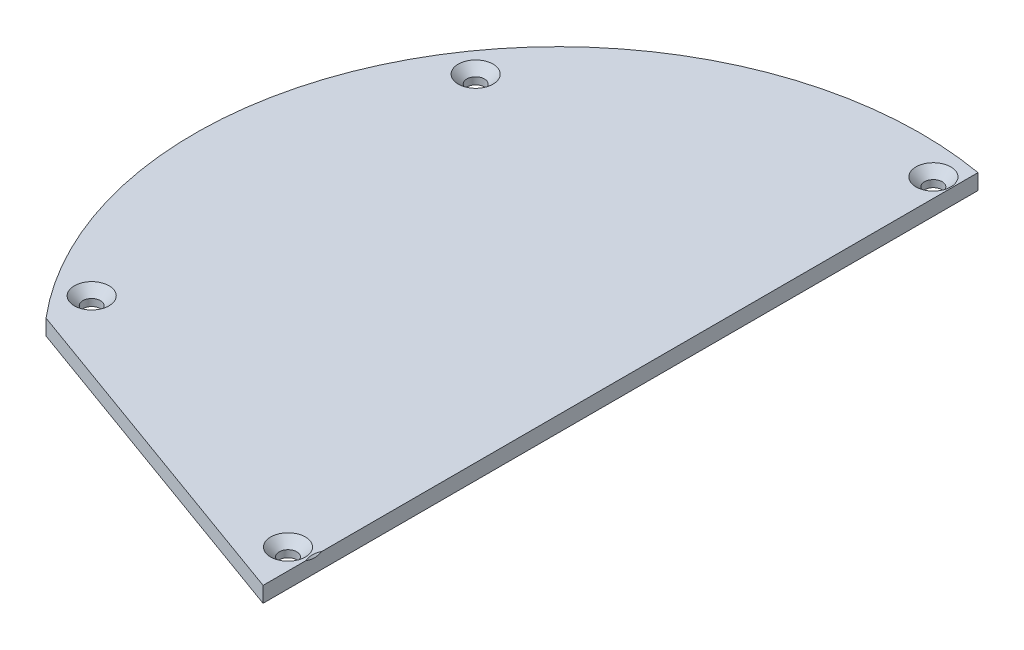
ISO-10303-21;
HEADER;
FILE_DESCRIPTION(('STEP AP214'),'2;1');
FILE_NAME('part.step','',(''),(''),'','','');
FILE_SCHEMA(('AUTOMOTIVE_DESIGN { 1 0 10303 214 1 1 1 1 }'));
ENDSEC;
DATA;
#1=APPLICATION_CONTEXT('core data for automotive mechanical design processes');
#2=APPLICATION_PROTOCOL_DEFINITION('international standard','automotive_design',2000,#1);
#3=PRODUCT_CONTEXT('',#1,'mechanical');
#4=PRODUCT('Part','Part','',(#3));
#5=PRODUCT_RELATED_PRODUCT_CATEGORY('part','',(#4));
#6=PRODUCT_DEFINITION_FORMATION('','',#4);
#7=PRODUCT_DEFINITION_CONTEXT('part definition',#1,'design');
#8=PRODUCT_DEFINITION('design','',#6,#7);
#9=PRODUCT_DEFINITION_SHAPE('','',#8);
#10=(LENGTH_UNIT() NAMED_UNIT(*) SI_UNIT(.MILLI.,.METRE.));
#11=(NAMED_UNIT(*) PLANE_ANGLE_UNIT() SI_UNIT($,.RADIAN.));
#12=(NAMED_UNIT(*) SI_UNIT($,.STERADIAN.) SOLID_ANGLE_UNIT());
#13=UNCERTAINTY_MEASURE_WITH_UNIT(LENGTH_MEASURE(1.E-05),#10,'distance_accuracy_value','');
#14=(GEOMETRIC_REPRESENTATION_CONTEXT(3) GLOBAL_UNCERTAINTY_ASSIGNED_CONTEXT((#13)) GLOBAL_UNIT_ASSIGNED_CONTEXT((#10,
#11,#12)) REPRESENTATION_CONTEXT('',''));
#15=CARTESIAN_POINT('',(0.,0.,0.));
#16=DIRECTION('',(0.,0.,1.));
#17=DIRECTION('',(1.,0.,0.));
#18=AXIS2_PLACEMENT_3D('',#15,#16,#17);
#19=CARTESIAN_POINT('',(0.,3.,0.));
#20=DIRECTION('',(0.,-1.,0.));
#21=DIRECTION('',(0.,0.,-1.));
#22=AXIS2_PLACEMENT_3D('',#19,#20,#21);
#23=CYLINDRICAL_SURFACE('',#22,70.);
#24=CARTESIAN_POINT('',(0.,0.,0.));
#25=DIRECTION('',(0.,1.,0.));
#26=DIRECTION('',(0.,0.,1.));
#27=AXIS2_PLACEMENT_3D('',#24,#25,#26);
#28=CIRCLE('',#27,70.);
#29=CARTESIAN_POINT('',(12.,0.,-68.9637585982667));
#30=VERTEX_POINT('',#29);
#31=CARTESIAN_POINT('',(-53.5285765580916,0.,45.1075547072165));
#32=VERTEX_POINT('',#31);
#33=EDGE_CURVE('E96',#30,#32,#28,.T.);
#34=ORIENTED_EDGE('',*,*,#33,.T.);
#35=DIRECTION('',(0.,-1.,0.));
#36=VECTOR('',#35,1.);
#37=CARTESIAN_POINT('',(-53.5285765580916,3.,45.1075547072165));
#38=LINE('',#37,#36);
#39=CARTESIAN_POINT('',(-53.5285765580916,3.,45.1075547072165));
#40=VERTEX_POINT('',#39);
#41=EDGE_CURVE('E55',#40,#32,#38,.T.);
#42=ORIENTED_EDGE('',*,*,#41,.F.);
#43=CARTESIAN_POINT('',(0.,3.,0.));
#44=DIRECTION('',(0.,1.,0.));
#45=DIRECTION('',(0.,0.,1.));
#46=AXIS2_PLACEMENT_3D('',#43,#44,#45);
#47=CIRCLE('',#46,70.);
#48=CARTESIAN_POINT('',(12.,3.,-68.9637585982667));
#49=VERTEX_POINT('',#48);
#50=EDGE_CURVE('E103',#49,#40,#47,.T.);
#51=ORIENTED_EDGE('',*,*,#50,.F.);
#52=DIRECTION('',(0.,-1.,0.));
#53=VECTOR('',#52,1.);
#54=CARTESIAN_POINT('',(12.,3.,-68.9637585982667));
#55=LINE('',#54,#53);
#56=EDGE_CURVE('E99',#49,#30,#55,.T.);
#57=ORIENTED_EDGE('',*,*,#56,.T.);
#58=EDGE_LOOP('',(#34,#42,#51,#57));
#59=FACE_BOUND('',#58,.T.);
#60=ADVANCED_FACE('F39',(#59),#23,.T.);
#61=CARTESIAN_POINT('',(12.,3.,68.8024057733702));
#62=DIRECTION('',(0.340047568201704,0.,-0.940408236544166));
#63=DIRECTION('',(-0.940408236544166,0.,-0.340047568201704));
#64=AXIS2_PLACEMENT_3D('',#61,#62,#63);
#65=PLANE('',#64);
#66=DIRECTION('',(0.940408236544166,0.,0.340047568201704));
#67=VECTOR('',#66,1.);
#68=CARTESIAN_POINT('',(12.,0.,68.8024057733702));
#69=LINE('',#68,#67);
#70=CARTESIAN_POINT('',(12.,0.,68.8024057733702));
#71=VERTEX_POINT('',#70);
#72=EDGE_CURVE('E108',#32,#71,#69,.T.);
#73=ORIENTED_EDGE('',*,*,#72,.T.);
#74=DIRECTION('',(0.,-1.,0.));
#75=VECTOR('',#74,1.);
#76=CARTESIAN_POINT('',(12.,3.,68.8024057733702));
#77=LINE('',#76,#75);
#78=CARTESIAN_POINT('',(12.,3.,68.8024057733702));
#79=VERTEX_POINT('',#78);
#80=EDGE_CURVE('E114',#79,#71,#77,.T.);
#81=ORIENTED_EDGE('',*,*,#80,.F.);
#82=DIRECTION('',(0.940408236544166,0.,0.340047568201704));
#83=VECTOR('',#82,1.);
#84=CARTESIAN_POINT('',(12.,3.,68.8024057733702));
#85=LINE('',#84,#83);
#86=EDGE_CURVE('E90',#40,#79,#85,.T.);
#87=ORIENTED_EDGE('',*,*,#86,.F.);
#88=ORIENTED_EDGE('',*,*,#41,.T.);
#89=EDGE_LOOP('',(#73,#81,#87,#88));
#90=FACE_BOUND('',#89,.T.);
#91=ADVANCED_FACE('F113',(#90),#65,.F.);
#92=CARTESIAN_POINT('',(12.,3.,-68.9637585982667));
#93=DIRECTION('',(-1.,0.,0.));
#94=DIRECTION('',(0.,0.,1.));
#95=AXIS2_PLACEMENT_3D('',#92,#93,#94);
#96=PLANE('',#95);
#97=DIRECTION('',(0.,0.,-1.));
#98=VECTOR('',#97,1.);
#99=CARTESIAN_POINT('',(12.,3.,-68.9637585982667));
#100=LINE('',#99,#98);
#101=CARTESIAN_POINT('',(12.,3.,57.5091948484124));
#102=VERTEX_POINT('',#101);
#103=EDGE_CURVE('E62',#102,#49,#100,.T.);
#104=ORIENTED_EDGE('',*,*,#103,.F.);
#105=CARTESIAN_POINT('',(12.,11.6764835810106,47.3536998439711));
#106=CARTESIAN_POINT('',(12.,11.3780206748948,47.6619339237445));
#107=CARTESIAN_POINT('',(12.,11.0799107016104,47.9705112519757));
#108=CARTESIAN_POINT('',(12.,10.4846444378635,48.5886301925014));
#109=CARTESIAN_POINT('',(12.,10.1874882230472,48.8981718776245));
#110=CARTESIAN_POINT('',(12.,9.5934292401605,49.5194896485742));
#111=CARTESIAN_POINT('',(12.,9.29653066341606,49.8312697463403));
#112=CARTESIAN_POINT('',(12.,8.70444058307031,50.4564089611775));
#113=CARTESIAN_POINT('',(12.,8.40924897035373,50.7697679748678));
#114=CARTESIAN_POINT('',(12.,7.78409251671259,51.4382967939839));
#115=CARTESIAN_POINT('',(12.,7.4544364570012,51.7937563577713));
#116=CARTESIAN_POINT('',(12.,6.96323700747718,52.3300289986679));
#117=CARTESIAN_POINT('',(12.,6.80003320615012,52.5093206778738));
#118=CARTESIAN_POINT('',(12.,6.47503135878964,52.8691726928018));
#119=CARTESIAN_POINT('',(12.,6.31323330113839,53.0497330180168));
#120=CARTESIAN_POINT('',(12.,5.99173303464195,53.4121064088299));
#121=CARTESIAN_POINT('',(12.,5.83202745882402,53.5939164828746));
#122=CARTESIAN_POINT('',(12.,5.51495583844765,53.9595622509078));
#123=CARTESIAN_POINT('',(12.,5.35758973124143,54.1433978904241));
#124=CARTESIAN_POINT('',(12.,5.04604790988479,54.5136492111702));
#125=CARTESIAN_POINT('',(12.,4.89187110155214,54.70006396966));
#126=CARTESIAN_POINT('',(12.,4.5878523717263,55.0763863107464));
#127=CARTESIAN_POINT('',(12.,4.43800993521018,55.2662934739422));
#128=CARTESIAN_POINT('',(12.,4.22013844194805,55.5518463408471));
#129=CARTESIAN_POINT('',(12.,4.14971832151968,55.6456673577762));
#130=CARTESIAN_POINT('',(12.,4.01066833290255,55.8346354352724));
#131=CARTESIAN_POINT('',(12.,3.94203852556572,55.9297825407443));
#132=CARTESIAN_POINT('',(12.,3.80688541683227,56.1217457403606));
#133=CARTESIAN_POINT('',(12.,3.74036488695937,56.2185637916209));
#134=CARTESIAN_POINT('',(12.,3.61004871495045,56.4140197756088));
#135=CARTESIAN_POINT('',(12.,3.54625298679805,56.5126576507473));
#136=CARTESIAN_POINT('',(12.,3.42298282417226,56.7106092411609));
#137=CARTESIAN_POINT('',(12.,3.36345879839223,56.8098919198414));
#138=CARTESIAN_POINT('',(12.,3.2485819678286,57.0108808587326));
#139=CARTESIAN_POINT('',(12.,3.19322986995982,57.1125875258516));
#140=CARTESIAN_POINT('',(12.,3.08795060841099,57.3185357739809));
#141=CARTESIAN_POINT('',(12.,3.03801275994468,57.4227718464779));
#142=CARTESIAN_POINT('',(12.,2.94490723024692,57.6341991689699));
#143=CARTESIAN_POINT('',(12.,2.90173589813761,57.7413887884116));
#144=CARTESIAN_POINT('',(12.,2.82925496885618,57.9439103079715));
#145=CARTESIAN_POINT('',(12.,2.79885589350467,58.038848757274));
#146=CARTESIAN_POINT('',(12.,2.74565526118615,58.2308565958406));
#147=CARTESIAN_POINT('',(12.,2.72285315904254,58.3279258316614));
#148=CARTESIAN_POINT('',(12.,2.68616008957576,58.5231427782583));
#149=CARTESIAN_POINT('',(12.,2.67221512408078,58.6212801699669));
#150=CARTESIAN_POINT('',(12.,2.65388648455249,58.8184515017113));
#151=CARTESIAN_POINT('',(12.,2.64950176948293,58.9174853429515));
#152=CARTESIAN_POINT('',(12.,2.65057259312264,59.1125299393348));
#153=CARTESIAN_POINT('',(12.,2.65573746979506,59.2085424388762));
#154=CARTESIAN_POINT('',(12.,2.67500918801868,59.3996559264538));
#155=CARTESIAN_POINT('',(12.,2.68911656897716,59.4947568591534));
#156=CARTESIAN_POINT('',(12.,2.72556164405772,59.6839246282309));
#157=CARTESIAN_POINT('',(12.,2.7479473639127,59.777982064215));
#158=CARTESIAN_POINT('',(12.,2.79983819835453,59.9640926860291));
#159=CARTESIAN_POINT('',(12.,2.82934398922151,60.0561456805667));
#160=CARTESIAN_POINT('',(12.,2.89765741283179,60.2474219844967));
#161=CARTESIAN_POINT('',(12.,2.93710842129617,60.3464133633577));
#162=CARTESIAN_POINT('',(12.,3.02187867751455,60.5418576047958));
#163=CARTESIAN_POINT('',(12.,3.06719978319832,60.6383096519756));
#164=CARTESIAN_POINT('',(12.,3.16261398804212,60.8290119258743));
#165=CARTESIAN_POINT('',(12.,3.21271512609224,60.9232580992451));
#166=CARTESIAN_POINT('',(12.,3.3166763709614,61.1096194613672));
#167=CARTESIAN_POINT('',(12.,3.37053584302939,61.2017350064815));
#168=CARTESIAN_POINT('',(12.,3.48201955993258,61.3853222213545));
#169=CARTESIAN_POINT('',(12.,3.53968417740825,61.476769260088));
#170=CARTESIAN_POINT('',(12.,3.65753485906221,61.6580207561612));
#171=CARTESIAN_POINT('',(12.,3.71772098821849,61.7478251710855));
#172=CARTESIAN_POINT('',(12.,3.8400892655108,61.9259240468474));
#173=CARTESIAN_POINT('',(12.,3.90226930308774,62.0142199619169));
#174=CARTESIAN_POINT('',(12.,4.02832611726813,62.1895834936864));
#175=CARTESIAN_POINT('',(12.,4.09220282821923,62.2766511577142));
#176=CARTESIAN_POINT('',(12.,4.30798016111712,62.5658203686048));
#177=CARTESIAN_POINT('',(12.,4.46302723919002,62.7655741917588));
#178=CARTESIAN_POINT('',(12.,4.77830094472633,63.1609638959821));
#179=CARTESIAN_POINT('',(12.,4.93852842763963,63.3565990880362));
#180=CARTESIAN_POINT('',(12.,5.2627211760376,63.7448976523535));
#181=CARTESIAN_POINT('',(12.,5.42668818015196,63.9375595694483));
#182=CARTESIAN_POINT('',(12.,5.75730284328684,64.3205709935235));
#183=CARTESIAN_POINT('',(12.,5.92395057418987,64.510920438255));
#184=CARTESIAN_POINT('',(12.,6.25963507616733,64.8902540290843));
#185=CARTESIAN_POINT('',(12.,6.42867633827588,65.0792341944662));
#186=CARTESIAN_POINT('',(12.,6.76832601335083,65.4557837297529));
#187=CARTESIAN_POINT('',(12.,6.9389344490094,65.6433530791577));
#188=CARTESIAN_POINT('',(12.,7.45248452397064,66.2042728139137));
#189=CARTESIAN_POINT('',(12.,7.79725326532637,66.5759496273394));
#190=CARTESIAN_POINT('',(12.,8.4490758472777,67.2726576494576));
#191=CARTESIAN_POINT('',(12.,8.75577944889598,67.5980177764519));
#192=CARTESIAN_POINT('',(12.,9.37099492963593,68.2470777265156));
#193=CARTESIAN_POINT('',(12.,9.67950696542437,68.5707774010435));
#194=CARTESIAN_POINT('',(12.,10.2966054781193,69.2156226193883));
#195=CARTESIAN_POINT('',(12.,10.6051866977864,69.5367732001816));
#196=CARTESIAN_POINT('',(12.,11.2233321907855,70.1780642011995));
#197=CARTESIAN_POINT('',(12.,11.5328963610062,70.4982047207844));
#198=CARTESIAN_POINT('',(12.,11.8428232279845,70.8179921420213));
#199=B_SPLINE_CURVE_WITH_KNOTS('',3,(#105,#106,#107,#108,#109,#110,#111,#112,#113,#114,#115,
#116,#117,#118,#119,#120,#121,#122,#123,#124,#125,#126,#127,#128,#129,#130,#131,#132,#133,#134,
#135,#136,#137,#138,#139,#140,#141,#142,#143,#144,#145,#146,#147,#148,#149,#150,#151,#152,#153,
#154,#155,#156,#157,#158,#159,#160,#161,#162,#163,#164,#165,#166,#167,#168,#169,#170,#171,#172,
#173,#174,#175,#176,#177,#178,#179,#180,#181,#182,#183,#184,#185,#186,#187,#188,#189,#190,#191,
#192,#193,#194,#195,#196,#197,#198),.UNSPECIFIED.,.F.,.F.,(4,2,2,2,2,2,2,2,2,2,2,2,2,2,2,2,2,2,
2,2,2,2,2,2,2,2,2,2,2,2,2,2,2,2,2,2,2,2,2,2,2,2,2,2,2,2,4),(0.,1.28716685131265,2.5744333877011,
3.86601653445129,5.15751618505421,6.61186682743616,7.33920506083427,8.0665372773879,
8.79250277623692,9.51844879957463,10.2441414907509,10.9697475957709,11.3216578858416,
11.6735801216383,12.0259470714732,12.3783028895746,12.7255000920981,13.0727559940102,
13.4193136247673,13.7656836216484,14.0644802118667,14.3632553551204,14.6601910536585,
14.9570944166145,15.2451092581636,15.5331414742738,15.8228715789604,16.1126292136937,
16.4320809632179,16.7516340698258,17.0717343946899,17.3917807875392,17.7160602830003,
18.0403481401128,18.3643033869561,18.6882461166422,19.4466945478493,20.2052688692429,
20.9642033726012,21.723158260492,22.4838020211832,23.2444568131626,24.7653052003269,
26.1066921777961,27.4481971311457,28.784323793954,30.1203146454153),.UNSPECIFIED.);
#200=CARTESIAN_POINT('',(12.,3.,60.4908051515876));
#201=VERTEX_POINT('',#200);
#202=EDGE_CURVE('E11',#102,#201,#199,.T.);
#203=ORIENTED_EDGE('',*,*,#202,.T.);
#204=EDGE_CURVE('E92',#79,#201,#100,.T.);
#205=ORIENTED_EDGE('',*,*,#204,.F.);
#206=ORIENTED_EDGE('',*,*,#80,.T.);
#207=DIRECTION('',(0.,0.,-1.));
#208=VECTOR('',#207,1.);
#209=CARTESIAN_POINT('',(12.,0.,-68.9637585982667));
#210=LINE('',#209,#208);
#211=EDGE_CURVE('E85',#71,#30,#210,.T.);
#212=ORIENTED_EDGE('',*,*,#211,.T.);
#213=ORIENTED_EDGE('',*,*,#56,.F.);
#214=EDGE_LOOP('',(#104,#203,#205,#206,#212,#213));
#215=FACE_BOUND('',#214,.T.);
#216=ADVANCED_FACE('F97',(#215),#96,.F.);
#217=CARTESIAN_POINT('',(0.,3.,0.));
#218=DIRECTION('',(0.,1.,0.));
#219=DIRECTION('',(0.,0.,1.));
#220=AXIS2_PLACEMENT_3D('',#217,#218,#219);
#221=PLANE('',#220);
#222=CARTESIAN_POINT('',(-52.8353068566398,3.,36.9956801446427));
#223=DIRECTION('',(0.,1.,0.));
#224=DIRECTION('',(0.,0.,1.));
#225=AXIS2_PLACEMENT_3D('',#222,#223,#224);
#226=CIRCLE('',#225,3.35);
#227=CARTESIAN_POINT('',(-52.8353068566398,3.,40.3456801446427));
#228=VERTEX_POINT('',#227);
#229=EDGE_CURVE('E246',#228,#228,#226,.T.);
#230=ORIENTED_EDGE('',*,*,#229,.F.);
#231=EDGE_LOOP('',(#230));
#232=FACE_BOUND('',#231,.T.);
#233=CARTESIAN_POINT('',(8.00000000000001,3.,60.));
#234=DIRECTION('',(0.,1.,0.));
#235=DIRECTION('',(0.,0.,1.));
#236=AXIS2_PLACEMENT_3D('',#233,#234,#235);
#237=CIRCLE('',#236,3.35);
#238=CARTESIAN_POINT('',(8.00000000000001,3.,63.35));
#239=VERTEX_POINT('',#238);
#240=EDGE_CURVE('E251',#239,#239,#237,.T.);
#241=ORIENTED_EDGE('',*,*,#240,.F.);
#242=EDGE_LOOP('',(#241));
#243=FACE_BOUND('',#242,.T.);
#244=CARTESIAN_POINT('',(8.41893939819335,3.,-63.9481935586108));
#245=DIRECTION('',(0.,1.,0.));
#246=DIRECTION('',(0.,0.,1.));
#247=AXIS2_PLACEMENT_3D('',#244,#245,#246);
#248=CIRCLE('',#247,3.35);
#249=CARTESIAN_POINT('',(8.41893939819335,3.,-60.5981935586108));
#250=VERTEX_POINT('',#249);
#251=EDGE_CURVE('E265',#250,#250,#248,.T.);
#252=ORIENTED_EDGE('',*,*,#251,.F.);
#253=EDGE_LOOP('',(#252));
#254=FACE_BOUND('',#253,.T.);
#255=CARTESIAN_POINT('',(-52.8353068566401,3.,-36.9956801446423));
#256=DIRECTION('',(0.,1.,0.));
#257=DIRECTION('',(0.,0.,1.));
#258=AXIS2_PLACEMENT_3D('',#255,#256,#257);
#259=CIRCLE('',#258,3.35);
#260=CARTESIAN_POINT('',(-52.8353068566401,3.,-33.6456801446423));
#261=VERTEX_POINT('',#260);
#262=EDGE_CURVE('E271',#261,#261,#259,.T.);
#263=ORIENTED_EDGE('',*,*,#262,.F.);
#264=EDGE_LOOP('',(#263));
#265=FACE_BOUND('',#264,.T.);
#266=CARTESIAN_POINT('',(15.,3.,59.));
#267=DIRECTION('',(0.,1.,0.));
#268=DIRECTION('',(0.,0.,1.));
#269=AXIS2_PLACEMENT_3D('',#266,#267,#268);
#270=CIRCLE('',#269,3.35);
#271=EDGE_CURVE('E59',#102,#201,#270,.T.);
#272=ORIENTED_EDGE('',*,*,#271,.F.);
#273=ORIENTED_EDGE('',*,*,#103,.T.);
#274=ORIENTED_EDGE('',*,*,#50,.T.);
#275=ORIENTED_EDGE('',*,*,#86,.T.);
#276=ORIENTED_EDGE('',*,*,#204,.T.);
#277=EDGE_LOOP('',(#272,#273,#274,#275,#276));
#278=FACE_BOUND('',#277,.T.);
#279=ADVANCED_FACE('F94',(#232,#243,#254,#265,#278),#221,.T.);
#280=CARTESIAN_POINT('',(0.,0.,0.));
#281=DIRECTION('',(0.,1.,0.));
#282=DIRECTION('',(0.,0.,1.));
#283=AXIS2_PLACEMENT_3D('',#280,#281,#282);
#284=PLANE('',#283);
#285=CARTESIAN_POINT('',(-52.8353068566398,0.,36.9956801446427));
#286=DIRECTION('',(0.,1.,0.));
#287=DIRECTION('',(0.,0.,1.));
#288=AXIS2_PLACEMENT_3D('',#285,#286,#287);
#289=CIRCLE('',#288,1.69999999999999);
#290=CARTESIAN_POINT('',(-52.8353068566398,0.,38.6956801446427));
#291=VERTEX_POINT('',#290);
#292=EDGE_CURVE('E248',#291,#291,#289,.T.);
#293=ORIENTED_EDGE('',*,*,#292,.T.);
#294=EDGE_LOOP('',(#293));
#295=FACE_BOUND('',#294,.T.);
#296=CARTESIAN_POINT('',(8.00000000000001,0.,60.));
#297=DIRECTION('',(0.,1.,0.));
#298=DIRECTION('',(0.,0.,1.));
#299=AXIS2_PLACEMENT_3D('',#296,#297,#298);
#300=CIRCLE('',#299,1.69999999999999);
#301=CARTESIAN_POINT('',(8.00000000000001,0.,61.7));
#302=VERTEX_POINT('',#301);
#303=EDGE_CURVE('E259',#302,#302,#300,.T.);
#304=ORIENTED_EDGE('',*,*,#303,.T.);
#305=EDGE_LOOP('',(#304));
#306=FACE_BOUND('',#305,.T.);
#307=CARTESIAN_POINT('',(8.41893939819335,0.,-63.9481935586108));
#308=DIRECTION('',(0.,1.,0.));
#309=DIRECTION('',(0.,0.,1.));
#310=AXIS2_PLACEMENT_3D('',#307,#308,#309);
#311=CIRCLE('',#310,1.69999999999999);
#312=CARTESIAN_POINT('',(8.41893939819335,0.,-62.2481935586108));
#313=VERTEX_POINT('',#312);
#314=EDGE_CURVE('E268',#313,#313,#311,.T.);
#315=ORIENTED_EDGE('',*,*,#314,.T.);
#316=EDGE_LOOP('',(#315));
#317=FACE_BOUND('',#316,.T.);
#318=CARTESIAN_POINT('',(-52.8353068566401,0.,-36.9956801446423));
#319=DIRECTION('',(0.,1.,0.));
#320=DIRECTION('',(0.,0.,1.));
#321=AXIS2_PLACEMENT_3D('',#318,#319,#320);
#322=CIRCLE('',#321,1.69999999999999);
#323=CARTESIAN_POINT('',(-52.8353068566401,0.,-35.2956801446424));
#324=VERTEX_POINT('',#323);
#325=EDGE_CURVE('E100',#324,#324,#322,.T.);
#326=ORIENTED_EDGE('',*,*,#325,.T.);
#327=EDGE_LOOP('',(#326));
#328=FACE_BOUND('',#327,.T.);
#329=ORIENTED_EDGE('',*,*,#33,.F.);
#330=ORIENTED_EDGE('',*,*,#211,.F.);
#331=ORIENTED_EDGE('',*,*,#72,.F.);
#332=EDGE_LOOP('',(#329,#330,#331));
#333=FACE_BOUND('',#332,.T.);
#334=ADVANCED_FACE('F118',(#295,#306,#317,#328,#333),#284,.F.);
#335=CARTESIAN_POINT('',(15.,3.,59.));
#336=DIRECTION('',(0.,1.,0.));
#337=DIRECTION('',(0.,0.,1.));
#338=AXIS2_PLACEMENT_3D('',#335,#336,#337);
#339=CONICAL_SURFACE('',#338,3.35,0.785398163397448);
#340=ORIENTED_EDGE('',*,*,#271,.T.);
#341=ORIENTED_EDGE('',*,*,#202,.F.);
#342=EDGE_LOOP('',(#340,#341));
#343=FACE_BOUND('',#342,.T.);
#344=ADVANCED_FACE('F93',(#343),#339,.F.);
#345=CARTESIAN_POINT('',(-52.8353068566401,3.,-36.9956801446423));
#346=DIRECTION('',(0.,1.,0.));
#347=DIRECTION('',(0.,0.,1.));
#348=AXIS2_PLACEMENT_3D('',#345,#346,#347);
#349=CYLINDRICAL_SURFACE('',#348,1.69999999999999);
#350=ORIENTED_EDGE('',*,*,#325,.F.);
#351=EDGE_LOOP('',(#350));
#352=FACE_BOUND('',#351,.T.);
#353=CARTESIAN_POINT('',(-52.8353068566401,1.35,-36.9956801446423));
#354=DIRECTION('',(0.,1.,0.));
#355=DIRECTION('',(0.,0.,1.));
#356=AXIS2_PLACEMENT_3D('',#353,#354,#355);
#357=CIRCLE('',#356,1.7);
#358=CARTESIAN_POINT('',(-52.8353068566401,1.35,-35.2956801446423));
#359=VERTEX_POINT('',#358);
#360=EDGE_CURVE('E273',#359,#359,#357,.T.);
#361=ORIENTED_EDGE('',*,*,#360,.T.);
#362=EDGE_LOOP('',(#361));
#363=FACE_BOUND('',#362,.T.);
#364=ADVANCED_FACE('F130',(#352,#363),#349,.F.);
#365=CARTESIAN_POINT('',(-52.8353068566401,3.,-36.9956801446423));
#366=DIRECTION('',(0.,1.,0.));
#367=DIRECTION('',(0.,0.,1.));
#368=AXIS2_PLACEMENT_3D('',#365,#366,#367);
#369=CONICAL_SURFACE('',#368,3.35,0.785398163397448);
#370=ORIENTED_EDGE('',*,*,#360,.F.);
#371=EDGE_LOOP('',(#370));
#372=FACE_BOUND('',#371,.T.);
#373=ORIENTED_EDGE('',*,*,#262,.T.);
#374=EDGE_LOOP('',(#373));
#375=FACE_BOUND('',#374,.T.);
#376=ADVANCED_FACE('F170',(#372,#375),#369,.F.);
#377=CARTESIAN_POINT('',(8.41893939819335,3.,-63.9481935586108));
#378=DIRECTION('',(0.,1.,0.));
#379=DIRECTION('',(0.,0.,1.));
#380=AXIS2_PLACEMENT_3D('',#377,#378,#379);
#381=CYLINDRICAL_SURFACE('',#380,1.69999999999999);
#382=ORIENTED_EDGE('',*,*,#314,.F.);
#383=EDGE_LOOP('',(#382));
#384=FACE_BOUND('',#383,.T.);
#385=CARTESIAN_POINT('',(8.41893939819335,1.35,-63.9481935586108));
#386=DIRECTION('',(0.,1.,0.));
#387=DIRECTION('',(0.,0.,1.));
#388=AXIS2_PLACEMENT_3D('',#385,#386,#387);
#389=CIRCLE('',#388,1.7);
#390=CARTESIAN_POINT('',(8.41893939819335,1.35,-62.2481935586108));
#391=VERTEX_POINT('',#390);
#392=EDGE_CURVE('E264',#391,#391,#389,.T.);
#393=ORIENTED_EDGE('',*,*,#392,.T.);
#394=EDGE_LOOP('',(#393));
#395=FACE_BOUND('',#394,.T.);
#396=ADVANCED_FACE('F176',(#384,#395),#381,.F.);
#397=CARTESIAN_POINT('',(8.41893939819335,3.,-63.9481935586108));
#398=DIRECTION('',(0.,1.,0.));
#399=DIRECTION('',(0.,0.,1.));
#400=AXIS2_PLACEMENT_3D('',#397,#398,#399);
#401=CONICAL_SURFACE('',#400,3.35,0.785398163397448);
#402=ORIENTED_EDGE('',*,*,#392,.F.);
#403=EDGE_LOOP('',(#402));
#404=FACE_BOUND('',#403,.T.);
#405=ORIENTED_EDGE('',*,*,#251,.T.);
#406=EDGE_LOOP('',(#405));
#407=FACE_BOUND('',#406,.T.);
#408=ADVANCED_FACE('F186',(#404,#407),#401,.F.);
#409=CARTESIAN_POINT('',(8.00000000000001,3.,60.));
#410=DIRECTION('',(0.,1.,0.));
#411=DIRECTION('',(0.,0.,1.));
#412=AXIS2_PLACEMENT_3D('',#409,#410,#411);
#413=CYLINDRICAL_SURFACE('',#412,1.69999999999999);
#414=ORIENTED_EDGE('',*,*,#303,.F.);
#415=EDGE_LOOP('',(#414));
#416=FACE_BOUND('',#415,.T.);
#417=CARTESIAN_POINT('',(8.00000000000001,1.35,60.));
#418=DIRECTION('',(0.,1.,0.));
#419=DIRECTION('',(0.,0.,1.));
#420=AXIS2_PLACEMENT_3D('',#417,#418,#419);
#421=CIRCLE('',#420,1.7);
#422=CARTESIAN_POINT('',(8.00000000000001,1.35,61.7));
#423=VERTEX_POINT('',#422);
#424=EDGE_CURVE('E258',#423,#423,#421,.T.);
#425=ORIENTED_EDGE('',*,*,#424,.T.);
#426=EDGE_LOOP('',(#425));
#427=FACE_BOUND('',#426,.T.);
#428=ADVANCED_FACE('F197',(#416,#427),#413,.F.);
#429=CARTESIAN_POINT('',(8.00000000000001,3.,60.));
#430=DIRECTION('',(0.,1.,0.));
#431=DIRECTION('',(0.,0.,1.));
#432=AXIS2_PLACEMENT_3D('',#429,#430,#431);
#433=CONICAL_SURFACE('',#432,3.35,0.785398163397448);
#434=ORIENTED_EDGE('',*,*,#424,.F.);
#435=EDGE_LOOP('',(#434));
#436=FACE_BOUND('',#435,.T.);
#437=ORIENTED_EDGE('',*,*,#240,.T.);
#438=EDGE_LOOP('',(#437));
#439=FACE_BOUND('',#438,.T.);
#440=ADVANCED_FACE('F210',(#436,#439),#433,.F.);
#441=CARTESIAN_POINT('',(-52.8353068566398,3.,36.9956801446427));
#442=DIRECTION('',(0.,1.,0.));
#443=DIRECTION('',(0.,0.,1.));
#444=AXIS2_PLACEMENT_3D('',#441,#442,#443);
#445=CYLINDRICAL_SURFACE('',#444,1.69999999999999);
#446=ORIENTED_EDGE('',*,*,#292,.F.);
#447=EDGE_LOOP('',(#446));
#448=FACE_BOUND('',#447,.T.);
#449=CARTESIAN_POINT('',(-52.8353068566398,1.35,36.9956801446427));
#450=DIRECTION('',(0.,1.,0.));
#451=DIRECTION('',(0.,0.,1.));
#452=AXIS2_PLACEMENT_3D('',#449,#450,#451);
#453=CIRCLE('',#452,1.7);
#454=CARTESIAN_POINT('',(-52.8353068566398,1.35,38.6956801446427));
#455=VERTEX_POINT('',#454);
#456=EDGE_CURVE('E243',#455,#455,#453,.T.);
#457=ORIENTED_EDGE('',*,*,#456,.T.);
#458=EDGE_LOOP('',(#457));
#459=FACE_BOUND('',#458,.T.);
#460=ADVANCED_FACE('F220',(#448,#459),#445,.F.);
#461=CARTESIAN_POINT('',(-52.8353068566398,3.,36.9956801446427));
#462=DIRECTION('',(0.,1.,0.));
#463=DIRECTION('',(0.,0.,1.));
#464=AXIS2_PLACEMENT_3D('',#461,#462,#463);
#465=CONICAL_SURFACE('',#464,3.35,0.785398163397448);
#466=ORIENTED_EDGE('',*,*,#456,.F.);
#467=EDGE_LOOP('',(#466));
#468=FACE_BOUND('',#467,.T.);
#469=ORIENTED_EDGE('',*,*,#229,.T.);
#470=EDGE_LOOP('',(#469));
#471=FACE_BOUND('',#470,.T.);
#472=ADVANCED_FACE('F226',(#468,#471),#465,.F.);
#473=CLOSED_SHELL('',(#60,#91,#216,#279,#334,#344,#364,#376,#396,#408,#428,#440,#460,#472));
#474=MANIFOLD_SOLID_BREP('B2',#473);
#475=ADVANCED_BREP_SHAPE_REPRESENTATION('',(#18,#474),#14);
#476=SHAPE_DEFINITION_REPRESENTATION(#9,#475);
ENDSEC;
END-ISO-10303-21;
